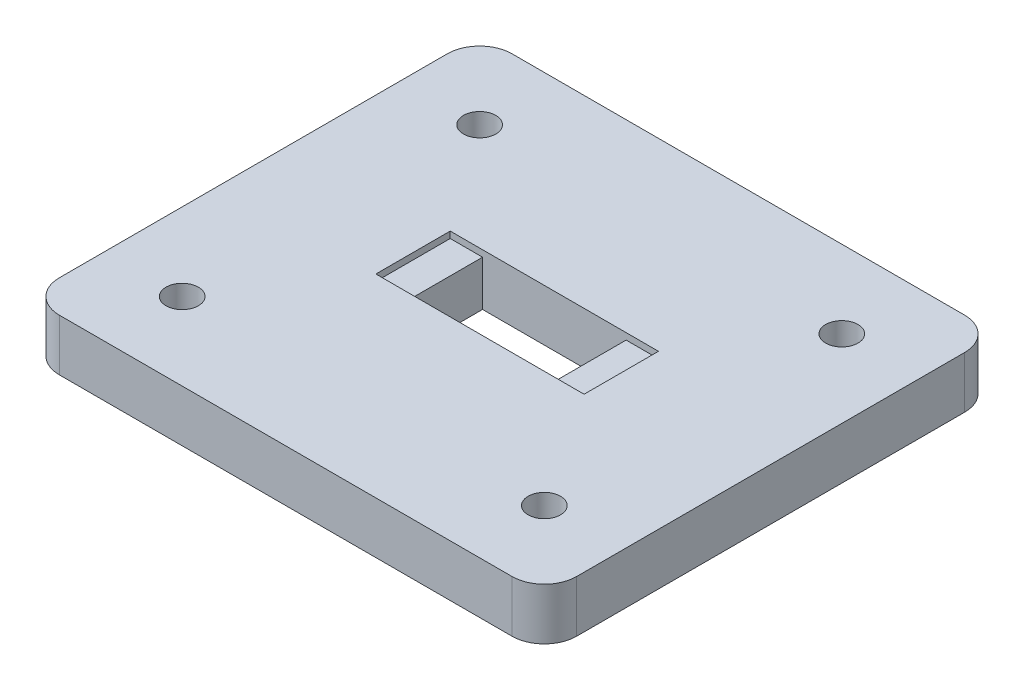
ISO-10303-21;
HEADER;
FILE_DESCRIPTION(('STEP AP214'),'2;1');
FILE_NAME('part.step','',(''),(''),'','','');
FILE_SCHEMA(('AUTOMOTIVE_DESIGN { 1 0 10303 214 1 1 1 1 }'));
ENDSEC;
DATA;
#1=APPLICATION_CONTEXT('core data for automotive mechanical design processes');
#2=APPLICATION_PROTOCOL_DEFINITION('international standard','automotive_design',2000,#1);
#3=PRODUCT_CONTEXT('',#1,'mechanical');
#4=PRODUCT('Part','Part','',(#3));
#5=PRODUCT_RELATED_PRODUCT_CATEGORY('part','',(#4));
#6=PRODUCT_DEFINITION_FORMATION('','',#4);
#7=PRODUCT_DEFINITION_CONTEXT('part definition',#1,'design');
#8=PRODUCT_DEFINITION('design','',#6,#7);
#9=PRODUCT_DEFINITION_SHAPE('','',#8);
#10=(LENGTH_UNIT() NAMED_UNIT(*) SI_UNIT(.MILLI.,.METRE.));
#11=(NAMED_UNIT(*) PLANE_ANGLE_UNIT() SI_UNIT($,.RADIAN.));
#12=(NAMED_UNIT(*) SI_UNIT($,.STERADIAN.) SOLID_ANGLE_UNIT());
#13=UNCERTAINTY_MEASURE_WITH_UNIT(LENGTH_MEASURE(1.E-05),#10,'distance_accuracy_value','');
#14=(GEOMETRIC_REPRESENTATION_CONTEXT(3) GLOBAL_UNCERTAINTY_ASSIGNED_CONTEXT((#13)) GLOBAL_UNIT_ASSIGNED_CONTEXT((#10,
#11,#12)) REPRESENTATION_CONTEXT('',''));
#15=CARTESIAN_POINT('',(0.,0.,0.));
#16=DIRECTION('',(0.,0.,1.));
#17=DIRECTION('',(1.,0.,0.));
#18=AXIS2_PLACEMENT_3D('',#15,#16,#17);
#19=CARTESIAN_POINT('',(0.,8.,0.));
#20=DIRECTION('',(0.,1.,0.));
#21=DIRECTION('',(0.,0.,1.));
#22=AXIS2_PLACEMENT_3D('',#19,#20,#21);
#23=PLANE('',#22);
#24=CARTESIAN_POINT('',(28.,8.,23.));
#25=DIRECTION('',(0.,1.,0.));
#26=DIRECTION('',(0.,0.,-1.));
#27=AXIS2_PLACEMENT_3D('',#24,#25,#26);
#28=CIRCLE('',#27,2.5);
#29=CARTESIAN_POINT('',(28.,8.,20.5));
#30=VERTEX_POINT('',#29);
#31=EDGE_CURVE('E480',#30,#30,#28,.T.);
#32=ORIENTED_EDGE('',*,*,#31,.F.);
#33=EDGE_LOOP('',(#32));
#34=FACE_BOUND('',#33,.T.);
#35=CARTESIAN_POINT('',(-28.,8.,-23.));
#36=DIRECTION('',(0.,1.,0.));
#37=DIRECTION('',(0.,0.,-1.));
#38=AXIS2_PLACEMENT_3D('',#35,#36,#37);
#39=CIRCLE('',#38,2.5);
#40=CARTESIAN_POINT('',(-28.,8.,-25.5));
#41=VERTEX_POINT('',#40);
#42=EDGE_CURVE('E482',#41,#41,#39,.T.);
#43=ORIENTED_EDGE('',*,*,#42,.F.);
#44=EDGE_LOOP('',(#43));
#45=FACE_BOUND('',#44,.T.);
#46=CARTESIAN_POINT('',(-28.,8.,23.));
#47=DIRECTION('',(0.,1.,0.));
#48=DIRECTION('',(0.,0.,1.));
#49=AXIS2_PLACEMENT_3D('',#46,#47,#48);
#50=CIRCLE('',#49,2.5);
#51=CARTESIAN_POINT('',(-28.,8.,25.5));
#52=VERTEX_POINT('',#51);
#53=EDGE_CURVE('E487',#52,#52,#50,.T.);
#54=ORIENTED_EDGE('',*,*,#53,.F.);
#55=EDGE_LOOP('',(#54));
#56=FACE_BOUND('',#55,.T.);
#57=CARTESIAN_POINT('',(28.,8.,-23.));
#58=DIRECTION('',(0.,1.,0.));
#59=DIRECTION('',(0.,0.,1.));
#60=AXIS2_PLACEMENT_3D('',#57,#58,#59);
#61=CIRCLE('',#60,2.5);
#62=CARTESIAN_POINT('',(28.,8.,-20.5));
#63=VERTEX_POINT('',#62);
#64=EDGE_CURVE('E337',#63,#63,#61,.T.);
#65=ORIENTED_EDGE('',*,*,#64,.F.);
#66=EDGE_LOOP('',(#65));
#67=FACE_BOUND('',#66,.T.);
#68=DIRECTION('',(1.,0.,0.));
#69=VECTOR('',#68,1.);
#70=CARTESIAN_POINT('',(-40.,8.,35.));
#71=LINE('',#70,#69);
#72=CARTESIAN_POINT('',(-35.,8.,35.));
#73=VERTEX_POINT('',#72);
#74=CARTESIAN_POINT('',(35.,8.,35.));
#75=VERTEX_POINT('',#74);
#76=EDGE_CURVE('E244',#73,#75,#71,.T.);
#77=ORIENTED_EDGE('',*,*,#76,.T.);
#78=CARTESIAN_POINT('',(35.,8.,30.));
#79=DIRECTION('',(0.,1.,0.));
#80=DIRECTION('',(0.,0.,1.));
#81=AXIS2_PLACEMENT_3D('',#78,#79,#80);
#82=CIRCLE('',#81,5.);
#83=CARTESIAN_POINT('',(40.,8.,30.));
#84=VERTEX_POINT('',#83);
#85=EDGE_CURVE('E297',#75,#84,#82,.T.);
#86=ORIENTED_EDGE('',*,*,#85,.T.);
#87=DIRECTION('',(0.,0.,-1.));
#88=VECTOR('',#87,1.);
#89=CARTESIAN_POINT('',(40.,8.,-35.));
#90=LINE('',#89,#88);
#91=CARTESIAN_POINT('',(40.,8.,-30.));
#92=VERTEX_POINT('',#91);
#93=EDGE_CURVE('E231',#84,#92,#90,.T.);
#94=ORIENTED_EDGE('',*,*,#93,.T.);
#95=CARTESIAN_POINT('',(35.,8.,-30.));
#96=DIRECTION('',(0.,1.,0.));
#97=DIRECTION('',(0.,0.,1.));
#98=AXIS2_PLACEMENT_3D('',#95,#96,#97);
#99=CIRCLE('',#98,5.);
#100=CARTESIAN_POINT('',(35.,8.,-35.));
#101=VERTEX_POINT('',#100);
#102=EDGE_CURVE('E288',#92,#101,#99,.T.);
#103=ORIENTED_EDGE('',*,*,#102,.T.);
#104=DIRECTION('',(-1.,0.,0.));
#105=VECTOR('',#104,1.);
#106=CARTESIAN_POINT('',(-40.,8.,-35.));
#107=LINE('',#106,#105);
#108=CARTESIAN_POINT('',(-35.,8.,-35.));
#109=VERTEX_POINT('',#108);
#110=EDGE_CURVE('E235',#101,#109,#107,.T.);
#111=ORIENTED_EDGE('',*,*,#110,.T.);
#112=CARTESIAN_POINT('',(-35.,8.,-30.));
#113=DIRECTION('',(0.,1.,0.));
#114=DIRECTION('',(0.,0.,1.));
#115=AXIS2_PLACEMENT_3D('',#112,#113,#114);
#116=CIRCLE('',#115,5.);
#117=CARTESIAN_POINT('',(-40.,8.,-30.));
#118=VERTEX_POINT('',#117);
#119=EDGE_CURVE('E291',#109,#118,#116,.T.);
#120=ORIENTED_EDGE('',*,*,#119,.T.);
#121=DIRECTION('',(0.,0.,1.));
#122=VECTOR('',#121,1.);
#123=CARTESIAN_POINT('',(-40.,8.,-35.));
#124=LINE('',#123,#122);
#125=CARTESIAN_POINT('',(-40.,8.,30.));
#126=VERTEX_POINT('',#125);
#127=EDGE_CURVE('E240',#118,#126,#124,.T.);
#128=ORIENTED_EDGE('',*,*,#127,.T.);
#129=CARTESIAN_POINT('',(-35.,8.,30.));
#130=DIRECTION('',(0.,1.,0.));
#131=DIRECTION('',(0.,0.,1.));
#132=AXIS2_PLACEMENT_3D('',#129,#130,#131);
#133=CIRCLE('',#132,5.);
#134=EDGE_CURVE('E294',#126,#73,#133,.T.);
#135=ORIENTED_EDGE('',*,*,#134,.T.);
#136=EDGE_LOOP('',(#77,#86,#94,#103,#111,#120,#128,#135));
#137=FACE_BOUND('',#136,.T.);
#138=DIRECTION('',(1.,0.,0.));
#139=VECTOR('',#138,1.);
#140=CARTESIAN_POINT('',(0.,8.,-6.48239770272545));
#141=LINE('',#140,#139);
#142=CARTESIAN_POINT('',(-16.0340390045143,8.,-6.48239770272545));
#143=VERTEX_POINT('',#142);
#144=CARTESIAN_POINT('',(16.1659609954857,8.,-6.48239770272545));
#145=VERTEX_POINT('',#144);
#146=EDGE_CURVE('E224',#143,#145,#141,.T.);
#147=ORIENTED_EDGE('',*,*,#146,.T.);
#148=DIRECTION('',(0.,0.,-1.));
#149=VECTOR('',#148,1.);
#150=CARTESIAN_POINT('',(16.1659609954857,8.,0.));
#151=LINE('',#150,#149);
#152=CARTESIAN_POINT('',(16.1659609954857,8.,5.01760229727455));
#153=VERTEX_POINT('',#152);
#154=EDGE_CURVE('E12',#153,#145,#151,.T.);
#155=ORIENTED_EDGE('',*,*,#154,.F.);
#156=DIRECTION('',(1.,0.,0.));
#157=VECTOR('',#156,1.);
#158=CARTESIAN_POINT('',(0.,8.,5.01760229727455));
#159=LINE('',#158,#157);
#160=CARTESIAN_POINT('',(-16.0340390045143,8.,5.01760229727455));
#161=VERTEX_POINT('',#160);
#162=EDGE_CURVE('E227',#161,#153,#159,.T.);
#163=ORIENTED_EDGE('',*,*,#162,.F.);
#164=DIRECTION('',(0.,0.,-1.));
#165=VECTOR('',#164,1.);
#166=CARTESIAN_POINT('',(-16.0340390045143,8.,0.));
#167=LINE('',#166,#165);
#168=EDGE_CURVE('E53',#161,#143,#167,.T.);
#169=ORIENTED_EDGE('',*,*,#168,.T.);
#170=EDGE_LOOP('',(#147,#155,#163,#169));
#171=FACE_BOUND('',#170,.T.);
#172=ADVANCED_FACE('F43',(#34,#45,#56,#67,#137,#171),#23,.T.);
#173=CARTESIAN_POINT('',(11.1659609954857,8.000012,0.));
#174=DIRECTION('',(1.,0.,0.));
#175=DIRECTION('',(0.,0.,-1.));
#176=AXIS2_PLACEMENT_3D('',#173,#174,#175);
#177=PLANE('',#176);
#178=DIRECTION('',(0.,0.,-1.));
#179=VECTOR('',#178,1.);
#180=CARTESIAN_POINT('',(11.1659609954857,7.,0.));
#181=LINE('',#180,#179);
#182=CARTESIAN_POINT('',(11.1659609954857,7.,5.01760229727455));
#183=VERTEX_POINT('',#182);
#184=CARTESIAN_POINT('',(11.1659609954857,7.,-6.48239770272545));
#185=VERTEX_POINT('',#184);
#186=EDGE_CURVE('E188',#183,#185,#181,.T.);
#187=ORIENTED_EDGE('',*,*,#186,.T.);
#188=DIRECTION('',(0.,-1.,0.));
#189=VECTOR('',#188,1.);
#190=CARTESIAN_POINT('',(11.1659609954857,8.000012,-6.48239770272545));
#191=LINE('',#190,#189);
#192=CARTESIAN_POINT('',(11.1659609954857,0.,-6.48239770272545));
#193=VERTEX_POINT('',#192);
#194=EDGE_CURVE('E186',#185,#193,#191,.T.);
#195=ORIENTED_EDGE('',*,*,#194,.T.);
#196=DIRECTION('',(0.,0.,-1.));
#197=VECTOR('',#196,1.);
#198=CARTESIAN_POINT('',(11.1659609954857,0.,0.));
#199=LINE('',#198,#197);
#200=CARTESIAN_POINT('',(11.1659609954857,0.,5.01760229727455));
#201=VERTEX_POINT('',#200);
#202=EDGE_CURVE('E321',#201,#193,#199,.T.);
#203=ORIENTED_EDGE('',*,*,#202,.F.);
#204=DIRECTION('',(0.,-1.,0.));
#205=VECTOR('',#204,1.);
#206=CARTESIAN_POINT('',(11.1659609954857,8.000012,5.01760229727455));
#207=LINE('',#206,#205);
#208=EDGE_CURVE('E221',#183,#201,#207,.T.);
#209=ORIENTED_EDGE('',*,*,#208,.F.);
#210=EDGE_LOOP('',(#187,#195,#203,#209));
#211=FACE_BOUND('',#210,.T.);
#212=ADVANCED_FACE('F365',(#211),#177,.F.);
#213=CARTESIAN_POINT('',(-11.0340390045143,8.000012,0.));
#214=DIRECTION('',(-1.,0.,0.));
#215=DIRECTION('',(0.,0.,1.));
#216=AXIS2_PLACEMENT_3D('',#213,#214,#215);
#217=PLANE('',#216);
#218=DIRECTION('',(0.,0.,-1.));
#219=VECTOR('',#218,1.);
#220=CARTESIAN_POINT('',(-11.0340390045143,7.,0.));
#221=LINE('',#220,#219);
#222=CARTESIAN_POINT('',(-11.0340390045143,7.,5.01760229727455));
#223=VERTEX_POINT('',#222);
#224=CARTESIAN_POINT('',(-11.0340390045143,7.,-6.48239770272545));
#225=VERTEX_POINT('',#224);
#226=EDGE_CURVE('E206',#223,#225,#221,.T.);
#227=ORIENTED_EDGE('',*,*,#226,.F.);
#228=DIRECTION('',(0.,-1.,0.));
#229=VECTOR('',#228,1.);
#230=CARTESIAN_POINT('',(-11.0340390045143,8.000012,5.01760229727455));
#231=LINE('',#230,#229);
#232=CARTESIAN_POINT('',(-11.0340390045143,0.,5.01760229727455));
#233=VERTEX_POINT('',#232);
#234=EDGE_CURVE('E68',#223,#233,#231,.T.);
#235=ORIENTED_EDGE('',*,*,#234,.T.);
#236=DIRECTION('',(0.,0.,1.));
#237=VECTOR('',#236,1.);
#238=CARTESIAN_POINT('',(-11.0340390045143,0.,0.));
#239=LINE('',#238,#237);
#240=CARTESIAN_POINT('',(-11.0340390045143,0.,-6.48239770272545));
#241=VERTEX_POINT('',#240);
#242=EDGE_CURVE('E314',#241,#233,#239,.T.);
#243=ORIENTED_EDGE('',*,*,#242,.F.);
#244=DIRECTION('',(0.,-1.,0.));
#245=VECTOR('',#244,1.);
#246=CARTESIAN_POINT('',(-11.0340390045143,8.000012,-6.48239770272545));
#247=LINE('',#246,#245);
#248=EDGE_CURVE('E216',#225,#241,#247,.T.);
#249=ORIENTED_EDGE('',*,*,#248,.F.);
#250=EDGE_LOOP('',(#227,#235,#243,#249));
#251=FACE_BOUND('',#250,.T.);
#252=ADVANCED_FACE('F371',(#251),#217,.F.);
#253=CARTESIAN_POINT('',(40.,8.,-35.));
#254=DIRECTION('',(-1.,0.,0.));
#255=DIRECTION('',(0.,0.,1.));
#256=AXIS2_PLACEMENT_3D('',#253,#254,#255);
#257=PLANE('',#256);
#258=ORIENTED_EDGE('',*,*,#93,.F.);
#259=DIRECTION('',(0.,-1.,0.));
#260=VECTOR('',#259,1.);
#261=CARTESIAN_POINT('',(40.,8.,30.));
#262=LINE('',#261,#260);
#263=CARTESIAN_POINT('',(40.,0.,30.));
#264=VERTEX_POINT('',#263);
#265=EDGE_CURVE('E265',#84,#264,#262,.T.);
#266=ORIENTED_EDGE('',*,*,#265,.T.);
#267=DIRECTION('',(0.,0.,-1.));
#268=VECTOR('',#267,1.);
#269=CARTESIAN_POINT('',(40.,0.,-35.));
#270=LINE('',#269,#268);
#271=CARTESIAN_POINT('',(40.,0.,-30.));
#272=VERTEX_POINT('',#271);
#273=EDGE_CURVE('E230',#264,#272,#270,.T.);
#274=ORIENTED_EDGE('',*,*,#273,.T.);
#275=DIRECTION('',(0.,-1.,0.));
#276=VECTOR('',#275,1.);
#277=CARTESIAN_POINT('',(40.,8.,-30.));
#278=LINE('',#277,#276);
#279=EDGE_CURVE('E248',#272,#92,#278,.F.);
#280=ORIENTED_EDGE('',*,*,#279,.T.);
#281=EDGE_LOOP('',(#258,#266,#274,#280));
#282=FACE_BOUND('',#281,.T.);
#283=ADVANCED_FACE('F393',(#282),#257,.F.);
#284=CARTESIAN_POINT('',(-40.,8.,-35.));
#285=DIRECTION('',(0.,0.,1.));
#286=DIRECTION('',(1.,0.,0.));
#287=AXIS2_PLACEMENT_3D('',#284,#285,#286);
#288=PLANE('',#287);
#289=DIRECTION('',(-1.,0.,0.));
#290=VECTOR('',#289,1.);
#291=CARTESIAN_POINT('',(-40.,0.,-35.));
#292=LINE('',#291,#290);
#293=CARTESIAN_POINT('',(35.,0.,-35.));
#294=VERTEX_POINT('',#293);
#295=CARTESIAN_POINT('',(-35.,0.,-35.));
#296=VERTEX_POINT('',#295);
#297=EDGE_CURVE('E252',#294,#296,#292,.T.);
#298=ORIENTED_EDGE('',*,*,#297,.T.);
#299=DIRECTION('',(0.,-1.,0.));
#300=VECTOR('',#299,1.);
#301=CARTESIAN_POINT('',(-35.,8.,-35.));
#302=LINE('',#301,#300);
#303=EDGE_CURVE('E311',#296,#109,#302,.F.);
#304=ORIENTED_EDGE('',*,*,#303,.T.);
#305=ORIENTED_EDGE('',*,*,#110,.F.);
#306=DIRECTION('',(0.,-1.,0.));
#307=VECTOR('',#306,1.);
#308=CARTESIAN_POINT('',(35.,8.,-35.));
#309=LINE('',#308,#307);
#310=EDGE_CURVE('E307',#101,#294,#309,.T.);
#311=ORIENTED_EDGE('',*,*,#310,.T.);
#312=EDGE_LOOP('',(#298,#304,#305,#311));
#313=FACE_BOUND('',#312,.T.);
#314=ADVANCED_FACE('F389',(#313),#288,.F.);
#315=CARTESIAN_POINT('',(-40.,8.,-35.));
#316=DIRECTION('',(1.,0.,0.));
#317=DIRECTION('',(0.,0.,-1.));
#318=AXIS2_PLACEMENT_3D('',#315,#316,#317);
#319=PLANE('',#318);
#320=DIRECTION('',(0.,0.,1.));
#321=VECTOR('',#320,1.);
#322=CARTESIAN_POINT('',(-40.,0.,-35.));
#323=LINE('',#322,#321);
#324=CARTESIAN_POINT('',(-40.,0.,-30.));
#325=VERTEX_POINT('',#324);
#326=CARTESIAN_POINT('',(-40.,0.,30.));
#327=VERTEX_POINT('',#326);
#328=EDGE_CURVE('E256',#325,#327,#323,.T.);
#329=ORIENTED_EDGE('',*,*,#328,.T.);
#330=DIRECTION('',(0.,-1.,0.));
#331=VECTOR('',#330,1.);
#332=CARTESIAN_POINT('',(-40.,8.,30.));
#333=LINE('',#332,#331);
#334=EDGE_CURVE('E304',#327,#126,#333,.F.);
#335=ORIENTED_EDGE('',*,*,#334,.T.);
#336=ORIENTED_EDGE('',*,*,#127,.F.);
#337=DIRECTION('',(0.,-1.,0.));
#338=VECTOR('',#337,1.);
#339=CARTESIAN_POINT('',(-40.,8.,-30.));
#340=LINE('',#339,#338);
#341=EDGE_CURVE('E300',#118,#325,#340,.T.);
#342=ORIENTED_EDGE('',*,*,#341,.T.);
#343=EDGE_LOOP('',(#329,#335,#336,#342));
#344=FACE_BOUND('',#343,.T.);
#345=ADVANCED_FACE('F385',(#344),#319,.F.);
#346=CARTESIAN_POINT('',(-40.,8.,35.));
#347=DIRECTION('',(0.,0.,-1.));
#348=DIRECTION('',(-1.,0.,0.));
#349=AXIS2_PLACEMENT_3D('',#346,#347,#348);
#350=PLANE('',#349);
#351=DIRECTION('',(1.,0.,0.));
#352=VECTOR('',#351,1.);
#353=CARTESIAN_POINT('',(-40.,0.,35.));
#354=LINE('',#353,#352);
#355=CARTESIAN_POINT('',(-35.,0.,35.));
#356=VERTEX_POINT('',#355);
#357=CARTESIAN_POINT('',(35.,0.,35.));
#358=VERTEX_POINT('',#357);
#359=EDGE_CURVE('E236',#356,#358,#354,.T.);
#360=ORIENTED_EDGE('',*,*,#359,.T.);
#361=DIRECTION('',(0.,-1.,0.));
#362=VECTOR('',#361,1.);
#363=CARTESIAN_POINT('',(35.,8.,35.));
#364=LINE('',#363,#362);
#365=EDGE_CURVE('E285',#358,#75,#364,.F.);
#366=ORIENTED_EDGE('',*,*,#365,.T.);
#367=ORIENTED_EDGE('',*,*,#76,.F.);
#368=DIRECTION('',(0.,-1.,0.));
#369=VECTOR('',#368,1.);
#370=CARTESIAN_POINT('',(-35.,8.,35.));
#371=LINE('',#370,#369);
#372=EDGE_CURVE('E281',#73,#356,#371,.T.);
#373=ORIENTED_EDGE('',*,*,#372,.T.);
#374=EDGE_LOOP('',(#360,#366,#367,#373));
#375=FACE_BOUND('',#374,.T.);
#376=ADVANCED_FACE('F382',(#375),#350,.F.);
#377=CARTESIAN_POINT('',(0.,0.,0.));
#378=DIRECTION('',(0.,1.,0.));
#379=DIRECTION('',(0.,0.,1.));
#380=AXIS2_PLACEMENT_3D('',#377,#378,#379);
#381=PLANE('',#380);
#382=CARTESIAN_POINT('',(28.,0.,23.));
#383=DIRECTION('',(0.,1.,0.));
#384=DIRECTION('',(0.,0.,1.));
#385=AXIS2_PLACEMENT_3D('',#382,#383,#384);
#386=CIRCLE('',#385,2.5);
#387=CARTESIAN_POINT('',(28.,0.,25.5));
#388=VERTEX_POINT('',#387);
#389=EDGE_CURVE('E47',#388,#388,#386,.T.);
#390=ORIENTED_EDGE('',*,*,#389,.T.);
#391=EDGE_LOOP('',(#390));
#392=FACE_BOUND('',#391,.T.);
#393=CARTESIAN_POINT('',(-28.,0.,-23.));
#394=DIRECTION('',(0.,1.,0.));
#395=DIRECTION('',(0.,0.,1.));
#396=AXIS2_PLACEMENT_3D('',#393,#394,#395);
#397=CIRCLE('',#396,2.5);
#398=CARTESIAN_POINT('',(-28.,0.,-20.5));
#399=VERTEX_POINT('',#398);
#400=EDGE_CURVE('E340',#399,#399,#397,.T.);
#401=ORIENTED_EDGE('',*,*,#400,.T.);
#402=EDGE_LOOP('',(#401));
#403=FACE_BOUND('',#402,.T.);
#404=CARTESIAN_POINT('',(-28.,0.,23.));
#405=DIRECTION('',(0.,1.,0.));
#406=DIRECTION('',(0.,0.,1.));
#407=AXIS2_PLACEMENT_3D('',#404,#405,#406);
#408=CIRCLE('',#407,2.5);
#409=CARTESIAN_POINT('',(-28.,0.,25.5));
#410=VERTEX_POINT('',#409);
#411=EDGE_CURVE('E336',#410,#410,#408,.T.);
#412=ORIENTED_EDGE('',*,*,#411,.T.);
#413=EDGE_LOOP('',(#412));
#414=FACE_BOUND('',#413,.T.);
#415=CARTESIAN_POINT('',(28.,0.,-23.));
#416=DIRECTION('',(0.,1.,0.));
#417=DIRECTION('',(0.,0.,1.));
#418=AXIS2_PLACEMENT_3D('',#415,#416,#417);
#419=CIRCLE('',#418,2.5);
#420=CARTESIAN_POINT('',(28.,0.,-20.5));
#421=VERTEX_POINT('',#420);
#422=EDGE_CURVE('E332',#421,#421,#419,.T.);
#423=ORIENTED_EDGE('',*,*,#422,.T.);
#424=EDGE_LOOP('',(#423));
#425=FACE_BOUND('',#424,.T.);
#426=ORIENTED_EDGE('',*,*,#242,.T.);
#427=DIRECTION('',(1.,0.,0.));
#428=VECTOR('',#427,1.);
#429=CARTESIAN_POINT('',(0.,0.,5.01760229727455));
#430=LINE('',#429,#428);
#431=EDGE_CURVE('E325',#233,#201,#430,.T.);
#432=ORIENTED_EDGE('',*,*,#431,.T.);
#433=ORIENTED_EDGE('',*,*,#202,.T.);
#434=DIRECTION('',(1.,0.,0.));
#435=VECTOR('',#434,1.);
#436=CARTESIAN_POINT('',(0.,0.,-6.48239770272545));
#437=LINE('',#436,#435);
#438=EDGE_CURVE('E318',#241,#193,#437,.T.);
#439=ORIENTED_EDGE('',*,*,#438,.F.);
#440=EDGE_LOOP('',(#426,#432,#433,#439));
#441=FACE_BOUND('',#440,.T.);
#442=ORIENTED_EDGE('',*,*,#273,.F.);
#443=CARTESIAN_POINT('',(35.,0.,30.));
#444=DIRECTION('',(0.,1.,0.));
#445=DIRECTION('',(0.,0.,1.));
#446=AXIS2_PLACEMENT_3D('',#443,#444,#445);
#447=CIRCLE('',#446,5.);
#448=EDGE_CURVE('E278',#264,#358,#447,.F.);
#449=ORIENTED_EDGE('',*,*,#448,.T.);
#450=ORIENTED_EDGE('',*,*,#359,.F.);
#451=CARTESIAN_POINT('',(-35.,0.,30.));
#452=DIRECTION('',(0.,1.,0.));
#453=DIRECTION('',(0.,0.,1.));
#454=AXIS2_PLACEMENT_3D('',#451,#452,#453);
#455=CIRCLE('',#454,5.);
#456=EDGE_CURVE('E275',#356,#327,#455,.F.);
#457=ORIENTED_EDGE('',*,*,#456,.T.);
#458=ORIENTED_EDGE('',*,*,#328,.F.);
#459=CARTESIAN_POINT('',(-35.,0.,-30.));
#460=DIRECTION('',(0.,1.,0.));
#461=DIRECTION('',(0.,0.,1.));
#462=AXIS2_PLACEMENT_3D('',#459,#460,#461);
#463=CIRCLE('',#462,5.);
#464=EDGE_CURVE('E272',#325,#296,#463,.F.);
#465=ORIENTED_EDGE('',*,*,#464,.T.);
#466=ORIENTED_EDGE('',*,*,#297,.F.);
#467=CARTESIAN_POINT('',(35.,0.,-30.));
#468=DIRECTION('',(0.,1.,0.));
#469=DIRECTION('',(0.,0.,1.));
#470=AXIS2_PLACEMENT_3D('',#467,#468,#469);
#471=CIRCLE('',#470,5.);
#472=EDGE_CURVE('E269',#294,#272,#471,.F.);
#473=ORIENTED_EDGE('',*,*,#472,.T.);
#474=EDGE_LOOP('',(#442,#449,#450,#457,#458,#465,#466,#473));
#475=FACE_BOUND('',#474,.T.);
#476=ADVANCED_FACE('F349',(#392,#403,#414,#425,#441,#475),#381,.F.);
#477=CARTESIAN_POINT('',(35.,8.,30.));
#478=DIRECTION('',(0.,-1.,0.));
#479=DIRECTION('',(0.,0.,-1.));
#480=AXIS2_PLACEMENT_3D('',#477,#478,#479);
#481=CYLINDRICAL_SURFACE('',#480,5.);
#482=ORIENTED_EDGE('',*,*,#85,.F.);
#483=ORIENTED_EDGE('',*,*,#365,.F.);
#484=ORIENTED_EDGE('',*,*,#448,.F.);
#485=ORIENTED_EDGE('',*,*,#265,.F.);
#486=EDGE_LOOP('',(#482,#483,#484,#485));
#487=FACE_BOUND('',#486,.T.);
#488=ADVANCED_FACE('F381',(#487),#481,.T.);
#489=CARTESIAN_POINT('',(-35.,8.,30.));
#490=DIRECTION('',(0.,-1.,0.));
#491=DIRECTION('',(0.,0.,-1.));
#492=AXIS2_PLACEMENT_3D('',#489,#490,#491);
#493=CYLINDRICAL_SURFACE('',#492,5.);
#494=ORIENTED_EDGE('',*,*,#134,.F.);
#495=ORIENTED_EDGE('',*,*,#334,.F.);
#496=ORIENTED_EDGE('',*,*,#456,.F.);
#497=ORIENTED_EDGE('',*,*,#372,.F.);
#498=EDGE_LOOP('',(#494,#495,#496,#497));
#499=FACE_BOUND('',#498,.T.);
#500=ADVANCED_FACE('F400',(#499),#493,.T.);
#501=CARTESIAN_POINT('',(-35.,8.,-30.));
#502=DIRECTION('',(0.,-1.,0.));
#503=DIRECTION('',(0.,0.,-1.));
#504=AXIS2_PLACEMENT_3D('',#501,#502,#503);
#505=CYLINDRICAL_SURFACE('',#504,5.);
#506=ORIENTED_EDGE('',*,*,#119,.F.);
#507=ORIENTED_EDGE('',*,*,#303,.F.);
#508=ORIENTED_EDGE('',*,*,#464,.F.);
#509=ORIENTED_EDGE('',*,*,#341,.F.);
#510=EDGE_LOOP('',(#506,#507,#508,#509));
#511=FACE_BOUND('',#510,.T.);
#512=ADVANCED_FACE('F403',(#511),#505,.T.);
#513=CARTESIAN_POINT('',(35.,8.,-30.));
#514=DIRECTION('',(0.,-1.,0.));
#515=DIRECTION('',(0.,0.,-1.));
#516=AXIS2_PLACEMENT_3D('',#513,#514,#515);
#517=CYLINDRICAL_SURFACE('',#516,5.);
#518=ORIENTED_EDGE('',*,*,#102,.F.);
#519=ORIENTED_EDGE('',*,*,#279,.F.);
#520=ORIENTED_EDGE('',*,*,#472,.F.);
#521=ORIENTED_EDGE('',*,*,#310,.F.);
#522=EDGE_LOOP('',(#518,#519,#520,#521));
#523=FACE_BOUND('',#522,.T.);
#524=ADVANCED_FACE('F45',(#523),#517,.T.);
#525=CARTESIAN_POINT('',(0.,8.000012,5.01760229727455));
#526=DIRECTION('',(0.,0.,1.));
#527=DIRECTION('',(1.,0.,0.));
#528=AXIS2_PLACEMENT_3D('',#525,#526,#527);
#529=PLANE('',#528);
#530=ORIENTED_EDGE('',*,*,#162,.T.);
#531=DIRECTION('',(0.,-1.,0.));
#532=VECTOR('',#531,1.);
#533=CARTESIAN_POINT('',(16.1659609954857,8.000012,5.01760229727455));
#534=LINE('',#533,#532);
#535=CARTESIAN_POINT('',(16.1659609954857,7.,5.01760229727455));
#536=VERTEX_POINT('',#535);
#537=EDGE_CURVE('E171',#153,#536,#534,.T.);
#538=ORIENTED_EDGE('',*,*,#537,.T.);
#539=DIRECTION('',(-1.,0.,0.));
#540=VECTOR('',#539,1.);
#541=CARTESIAN_POINT('',(0.,7.,5.01760229727455));
#542=LINE('',#541,#540);
#543=EDGE_CURVE('E179',#536,#183,#542,.T.);
#544=ORIENTED_EDGE('',*,*,#543,.T.);
#545=ORIENTED_EDGE('',*,*,#208,.T.);
#546=ORIENTED_EDGE('',*,*,#431,.F.);
#547=ORIENTED_EDGE('',*,*,#234,.F.);
#548=DIRECTION('',(1.,0.,0.));
#549=VECTOR('',#548,1.);
#550=CARTESIAN_POINT('',(0.,7.,5.01760229727455));
#551=LINE('',#550,#549);
#552=CARTESIAN_POINT('',(-16.0340390045143,7.,5.01760229727455));
#553=VERTEX_POINT('',#552);
#554=EDGE_CURVE('E61',#553,#223,#551,.T.);
#555=ORIENTED_EDGE('',*,*,#554,.F.);
#556=DIRECTION('',(0.,-1.,0.));
#557=VECTOR('',#556,1.);
#558=CARTESIAN_POINT('',(-16.0340390045143,8.000012,5.01760229727455));
#559=LINE('',#558,#557);
#560=EDGE_CURVE('E209',#161,#553,#559,.T.);
#561=ORIENTED_EDGE('',*,*,#560,.F.);
#562=EDGE_LOOP('',(#530,#538,#544,#545,#546,#547,#555,#561));
#563=FACE_BOUND('',#562,.T.);
#564=ADVANCED_FACE('F378',(#563),#529,.F.);
#565=CARTESIAN_POINT('',(0.,8.000012,-6.48239770272545));
#566=DIRECTION('',(0.,0.,1.));
#567=DIRECTION('',(1.,0.,0.));
#568=AXIS2_PLACEMENT_3D('',#565,#566,#567);
#569=PLANE('',#568);
#570=ORIENTED_EDGE('',*,*,#146,.F.);
#571=DIRECTION('',(0.,-1.,0.));
#572=VECTOR('',#571,1.);
#573=CARTESIAN_POINT('',(-16.0340390045143,8.000012,-6.48239770272545));
#574=LINE('',#573,#572);
#575=CARTESIAN_POINT('',(-16.0340390045143,7.,-6.48239770272545));
#576=VERTEX_POINT('',#575);
#577=EDGE_CURVE('E181',#143,#576,#574,.T.);
#578=ORIENTED_EDGE('',*,*,#577,.T.);
#579=DIRECTION('',(1.,0.,0.));
#580=VECTOR('',#579,1.);
#581=CARTESIAN_POINT('',(0.,7.,-6.48239770272545));
#582=LINE('',#581,#580);
#583=EDGE_CURVE('E198',#576,#225,#582,.T.);
#584=ORIENTED_EDGE('',*,*,#583,.T.);
#585=ORIENTED_EDGE('',*,*,#248,.T.);
#586=ORIENTED_EDGE('',*,*,#438,.T.);
#587=ORIENTED_EDGE('',*,*,#194,.F.);
#588=DIRECTION('',(-1.,0.,0.));
#589=VECTOR('',#588,1.);
#590=CARTESIAN_POINT('',(0.,7.,-6.48239770272545));
#591=LINE('',#590,#589);
#592=CARTESIAN_POINT('',(16.1659609954857,7.,-6.48239770272545));
#593=VERTEX_POINT('',#592);
#594=EDGE_CURVE('E177',#593,#185,#591,.T.);
#595=ORIENTED_EDGE('',*,*,#594,.F.);
#596=DIRECTION('',(0.,-1.,0.));
#597=VECTOR('',#596,1.);
#598=CARTESIAN_POINT('',(16.1659609954857,8.000012,-6.48239770272545));
#599=LINE('',#598,#597);
#600=EDGE_CURVE('E162',#145,#593,#599,.T.);
#601=ORIENTED_EDGE('',*,*,#600,.F.);
#602=EDGE_LOOP('',(#570,#578,#584,#585,#586,#587,#595,#601));
#603=FACE_BOUND('',#602,.T.);
#604=ADVANCED_FACE('F184',(#603),#569,.T.);
#605=CARTESIAN_POINT('',(-16.0340390045143,8.000012,0.));
#606=DIRECTION('',(1.,0.,0.));
#607=DIRECTION('',(0.,0.,-1.));
#608=AXIS2_PLACEMENT_3D('',#605,#606,#607);
#609=PLANE('',#608);
#610=ORIENTED_EDGE('',*,*,#560,.T.);
#611=DIRECTION('',(0.,0.,1.));
#612=VECTOR('',#611,1.);
#613=CARTESIAN_POINT('',(-16.0340390045143,7.,0.));
#614=LINE('',#613,#612);
#615=EDGE_CURVE('E201',#576,#553,#614,.T.);
#616=ORIENTED_EDGE('',*,*,#615,.F.);
#617=ORIENTED_EDGE('',*,*,#577,.F.);
#618=ORIENTED_EDGE('',*,*,#168,.F.);
#619=EDGE_LOOP('',(#610,#616,#617,#618));
#620=FACE_BOUND('',#619,.T.);
#621=ADVANCED_FACE('F439',(#620),#609,.T.);
#622=CARTESIAN_POINT('',(0.,7.,0.));
#623=DIRECTION('',(0.,1.,0.));
#624=DIRECTION('',(0.,0.,1.));
#625=AXIS2_PLACEMENT_3D('',#622,#623,#624);
#626=PLANE('',#625);
#627=ORIENTED_EDGE('',*,*,#583,.F.);
#628=ORIENTED_EDGE('',*,*,#615,.T.);
#629=ORIENTED_EDGE('',*,*,#554,.T.);
#630=ORIENTED_EDGE('',*,*,#226,.T.);
#631=EDGE_LOOP('',(#627,#628,#629,#630));
#632=FACE_BOUND('',#631,.T.);
#633=ADVANCED_FACE('F441',(#632),#626,.T.);
#634=CARTESIAN_POINT('',(16.1659609954857,8.000012,0.));
#635=DIRECTION('',(1.,0.,0.));
#636=DIRECTION('',(0.,0.,-1.));
#637=AXIS2_PLACEMENT_3D('',#634,#635,#636);
#638=PLANE('',#637);
#639=ORIENTED_EDGE('',*,*,#154,.T.);
#640=ORIENTED_EDGE('',*,*,#600,.T.);
#641=DIRECTION('',(0.,0.,1.));
#642=VECTOR('',#641,1.);
#643=CARTESIAN_POINT('',(16.1659609954857,7.,0.));
#644=LINE('',#643,#642);
#645=EDGE_CURVE('E166',#593,#536,#644,.T.);
#646=ORIENTED_EDGE('',*,*,#645,.T.);
#647=ORIENTED_EDGE('',*,*,#537,.F.);
#648=EDGE_LOOP('',(#639,#640,#646,#647));
#649=FACE_BOUND('',#648,.T.);
#650=ADVANCED_FACE('F164',(#649),#638,.F.);
#651=CARTESIAN_POINT('',(0.,7.,0.));
#652=DIRECTION('',(0.,1.,0.));
#653=DIRECTION('',(0.,0.,1.));
#654=AXIS2_PLACEMENT_3D('',#651,#652,#653);
#655=PLANE('',#654);
#656=ORIENTED_EDGE('',*,*,#645,.F.);
#657=ORIENTED_EDGE('',*,*,#594,.T.);
#658=ORIENTED_EDGE('',*,*,#186,.F.);
#659=ORIENTED_EDGE('',*,*,#543,.F.);
#660=EDGE_LOOP('',(#656,#657,#658,#659));
#661=FACE_BOUND('',#660,.T.);
#662=ADVANCED_FACE('F175',(#661),#655,.T.);
#663=CARTESIAN_POINT('',(28.,-23.,-23.));
#664=DIRECTION('',(0.,1.,0.));
#665=DIRECTION('',(0.,0.,1.));
#666=AXIS2_PLACEMENT_3D('',#663,#664,#665);
#667=CYLINDRICAL_SURFACE('',#666,2.5);
#668=ORIENTED_EDGE('',*,*,#64,.T.);
#669=EDGE_LOOP('',(#668));
#670=FACE_BOUND('',#669,.T.);
#671=ORIENTED_EDGE('',*,*,#422,.F.);
#672=EDGE_LOOP('',(#671));
#673=FACE_BOUND('',#672,.T.);
#674=ADVANCED_FACE('F466',(#670,#673),#667,.F.);
#675=CARTESIAN_POINT('',(-28.,-23.,23.));
#676=DIRECTION('',(0.,1.,0.));
#677=DIRECTION('',(0.,0.,1.));
#678=AXIS2_PLACEMENT_3D('',#675,#676,#677);
#679=CYLINDRICAL_SURFACE('',#678,2.5);
#680=ORIENTED_EDGE('',*,*,#53,.T.);
#681=EDGE_LOOP('',(#680));
#682=FACE_BOUND('',#681,.T.);
#683=ORIENTED_EDGE('',*,*,#411,.F.);
#684=EDGE_LOOP('',(#683));
#685=FACE_BOUND('',#684,.T.);
#686=ADVANCED_FACE('F359',(#682,#685),#679,.F.);
#687=CARTESIAN_POINT('',(-28.,-23.,-23.));
#688=DIRECTION('',(0.,1.,0.));
#689=DIRECTION('',(0.,0.,1.));
#690=AXIS2_PLACEMENT_3D('',#687,#688,#689);
#691=CYLINDRICAL_SURFACE('',#690,2.5);
#692=ORIENTED_EDGE('',*,*,#42,.T.);
#693=EDGE_LOOP('',(#692));
#694=FACE_BOUND('',#693,.T.);
#695=ORIENTED_EDGE('',*,*,#400,.F.);
#696=EDGE_LOOP('',(#695));
#697=FACE_BOUND('',#696,.T.);
#698=ADVANCED_FACE('F353',(#694,#697),#691,.F.);
#699=CARTESIAN_POINT('',(28.,-23.,23.));
#700=DIRECTION('',(0.,1.,0.));
#701=DIRECTION('',(0.,0.,1.));
#702=AXIS2_PLACEMENT_3D('',#699,#700,#701);
#703=CYLINDRICAL_SURFACE('',#702,2.5);
#704=ORIENTED_EDGE('',*,*,#31,.T.);
#705=EDGE_LOOP('',(#704));
#706=FACE_BOUND('',#705,.T.);
#707=ORIENTED_EDGE('',*,*,#389,.F.);
#708=EDGE_LOOP('',(#707));
#709=FACE_BOUND('',#708,.T.);
#710=ADVANCED_FACE('F351',(#706,#709),#703,.F.);
#711=CLOSED_SHELL('',(#172,#212,#252,#283,#314,#345,#376,#476,#488,#500,#512,#524,#564,#604,
#621,#633,#650,#662,#674,#686,#698,#710));
#712=MANIFOLD_SOLID_BREP('B2',#711);
#713=ADVANCED_BREP_SHAPE_REPRESENTATION('',(#18,#712),#14);
#714=SHAPE_DEFINITION_REPRESENTATION(#9,#713);
ENDSEC;
END-ISO-10303-21;
